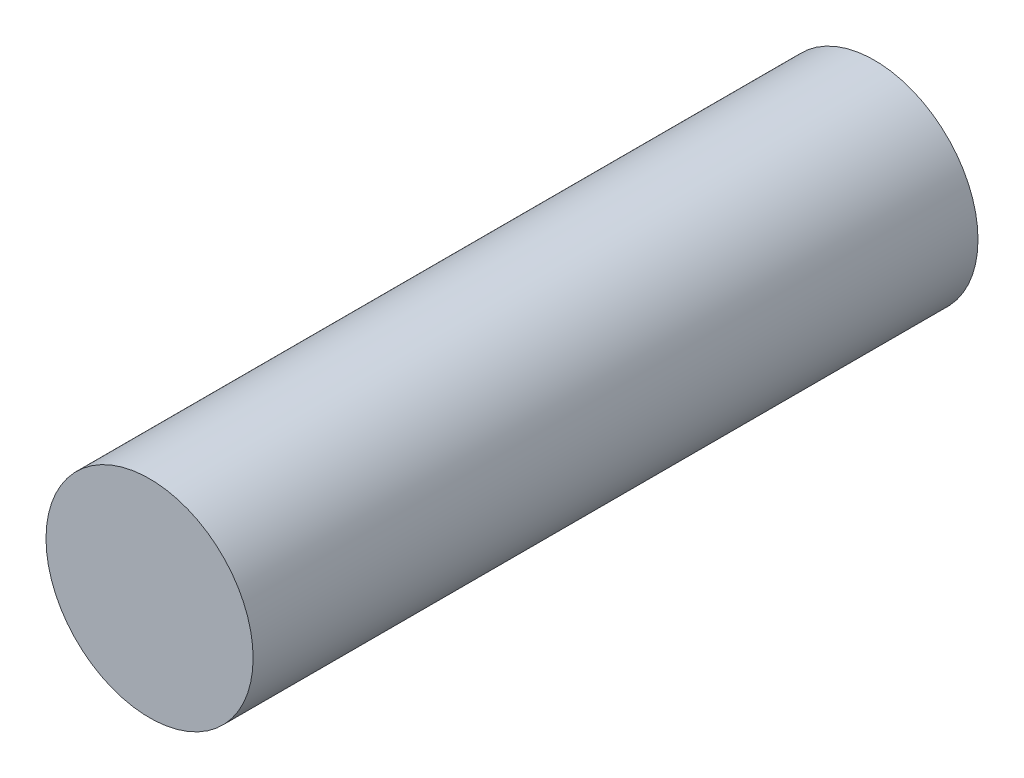
ISO-10303-21;
HEADER;
FILE_DESCRIPTION(('STEP AP214'),'2;1');
FILE_NAME('part.step','',(''),(''),'','','');
FILE_SCHEMA(('AUTOMOTIVE_DESIGN { 1 0 10303 214 1 1 1 1 }'));
ENDSEC;
DATA;
#1=APPLICATION_CONTEXT('core data for automotive mechanical design processes');
#2=APPLICATION_PROTOCOL_DEFINITION('international standard','automotive_design',2000,#1);
#3=PRODUCT_CONTEXT('',#1,'mechanical');
#4=PRODUCT('Part','Part','',(#3));
#5=PRODUCT_RELATED_PRODUCT_CATEGORY('part','',(#4));
#6=PRODUCT_DEFINITION_FORMATION('','',#4);
#7=PRODUCT_DEFINITION_CONTEXT('part definition',#1,'design');
#8=PRODUCT_DEFINITION('design','',#6,#7);
#9=PRODUCT_DEFINITION_SHAPE('','',#8);
#10=(LENGTH_UNIT() NAMED_UNIT(*) SI_UNIT(.MILLI.,.METRE.));
#11=(NAMED_UNIT(*) PLANE_ANGLE_UNIT() SI_UNIT($,.RADIAN.));
#12=(NAMED_UNIT(*) SI_UNIT($,.STERADIAN.) SOLID_ANGLE_UNIT());
#13=UNCERTAINTY_MEASURE_WITH_UNIT(LENGTH_MEASURE(1.E-05),#10,'distance_accuracy_value','');
#14=(GEOMETRIC_REPRESENTATION_CONTEXT(3) GLOBAL_UNCERTAINTY_ASSIGNED_CONTEXT((#13)) GLOBAL_UNIT_ASSIGNED_CONTEXT((#10,
#11,#12)) REPRESENTATION_CONTEXT('',''));
#15=CARTESIAN_POINT('',(0.,0.,0.));
#16=DIRECTION('',(0.,0.,1.));
#17=DIRECTION('',(1.,0.,0.));
#18=AXIS2_PLACEMENT_3D('',#15,#16,#17);
#19=CARTESIAN_POINT('',(0.,0.,44.45));
#20=DIRECTION('',(0.,0.,-1.));
#21=DIRECTION('',(-1.,0.,0.));
#22=AXIS2_PLACEMENT_3D('',#19,#20,#21);
#23=CYLINDRICAL_SURFACE('',#22,6.35);
#24=CARTESIAN_POINT('',(0.,0.,44.45));
#25=DIRECTION('',(0.,0.,1.));
#26=DIRECTION('',(1.,0.,0.));
#27=AXIS2_PLACEMENT_3D('',#24,#25,#26);
#28=CIRCLE('',#27,6.35);
#29=CARTESIAN_POINT('',(6.35,0.,44.45));
#30=VERTEX_POINT('',#29);
#31=EDGE_CURVE('E10',#30,#30,#28,.T.);
#32=ORIENTED_EDGE('',*,*,#31,.F.);
#33=EDGE_LOOP('',(#32));
#34=FACE_BOUND('',#33,.T.);
#35=CARTESIAN_POINT('',(0.,0.,0.));
#36=DIRECTION('',(0.,0.,1.));
#37=DIRECTION('',(1.,0.,0.));
#38=AXIS2_PLACEMENT_3D('',#35,#36,#37);
#39=CIRCLE('',#38,6.35);
#40=CARTESIAN_POINT('',(6.35,0.,0.));
#41=VERTEX_POINT('',#40);
#42=EDGE_CURVE('E34',#41,#41,#39,.T.);
#43=ORIENTED_EDGE('',*,*,#42,.T.);
#44=EDGE_LOOP('',(#43));
#45=FACE_BOUND('',#44,.T.);
#46=ADVANCED_FACE('F31',(#34,#45),#23,.T.);
#47=CARTESIAN_POINT('',(0.,0.,44.45));
#48=DIRECTION('',(0.,0.,1.));
#49=DIRECTION('',(1.,0.,0.));
#50=AXIS2_PLACEMENT_3D('',#47,#48,#49);
#51=PLANE('',#50);
#52=ORIENTED_EDGE('',*,*,#31,.T.);
#53=EDGE_LOOP('',(#52));
#54=FACE_BOUND('',#53,.T.);
#55=ADVANCED_FACE('F46',(#54),#51,.T.);
#56=CARTESIAN_POINT('',(0.,0.,0.));
#57=DIRECTION('',(0.,0.,1.));
#58=DIRECTION('',(1.,0.,0.));
#59=AXIS2_PLACEMENT_3D('',#56,#57,#58);
#60=PLANE('',#59);
#61=ORIENTED_EDGE('',*,*,#42,.F.);
#62=EDGE_LOOP('',(#61));
#63=FACE_BOUND('',#62,.T.);
#64=ADVANCED_FACE('F44',(#63),#60,.F.);
#65=CLOSED_SHELL('',(#46,#55,#64));
#66=MANIFOLD_SOLID_BREP('B2',#65);
#67=ADVANCED_BREP_SHAPE_REPRESENTATION('',(#18,#66),#14);
#68=SHAPE_DEFINITION_REPRESENTATION(#9,#67);
ENDSEC;
END-ISO-10303-21;
